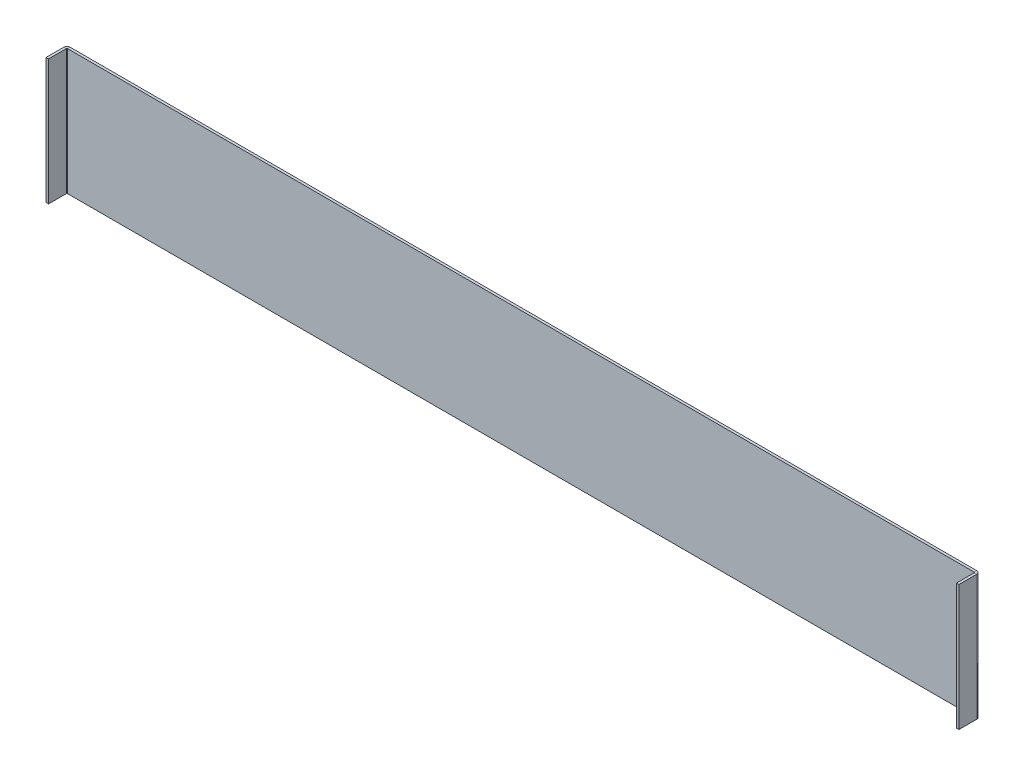
ISO-10303-21;
HEADER;
FILE_DESCRIPTION(('STEP AP214'),'2;1');
FILE_NAME('part.step','',(''),(''),'','','');
FILE_SCHEMA(('AUTOMOTIVE_DESIGN { 1 0 10303 214 1 1 1 1 }'));
ENDSEC;
DATA;
#1=APPLICATION_CONTEXT('core data for automotive mechanical design processes');
#2=APPLICATION_PROTOCOL_DEFINITION('international standard','automotive_design',2000,#1);
#3=PRODUCT_CONTEXT('',#1,'mechanical');
#4=PRODUCT('Part','Part','',(#3));
#5=PRODUCT_RELATED_PRODUCT_CATEGORY('part','',(#4));
#6=PRODUCT_DEFINITION_FORMATION('','',#4);
#7=PRODUCT_DEFINITION_CONTEXT('part definition',#1,'design');
#8=PRODUCT_DEFINITION('design','',#6,#7);
#9=PRODUCT_DEFINITION_SHAPE('','',#8);
#10=(LENGTH_UNIT() NAMED_UNIT(*) SI_UNIT(.MILLI.,.METRE.));
#11=(NAMED_UNIT(*) PLANE_ANGLE_UNIT() SI_UNIT($,.RADIAN.));
#12=(NAMED_UNIT(*) SI_UNIT($,.STERADIAN.) SOLID_ANGLE_UNIT());
#13=UNCERTAINTY_MEASURE_WITH_UNIT(LENGTH_MEASURE(1.E-05),#10,'distance_accuracy_value','');
#14=(GEOMETRIC_REPRESENTATION_CONTEXT(3) GLOBAL_UNCERTAINTY_ASSIGNED_CONTEXT((#13)) GLOBAL_UNIT_ASSIGNED_CONTEXT((#10,
#11,#12)) REPRESENTATION_CONTEXT('',''));
#15=CARTESIAN_POINT('',(0.,0.,0.));
#16=DIRECTION('',(0.,0.,1.));
#17=DIRECTION('',(1.,0.,0.));
#18=AXIS2_PLACEMENT_3D('',#15,#16,#17);
#19=CARTESIAN_POINT('',(-541.250000000007,75.,-24.9999999999999));
#20=DIRECTION('',(0.,1.,0.));
#21=DIRECTION('',(0.,0.,1.));
#22=AXIS2_PLACEMENT_3D('',#19,#20,#21);
#23=PLANE('',#22);
#24=DIRECTION('',(0.,0.,1.));
#25=VECTOR('',#24,1.);
#26=CARTESIAN_POINT('',(-541.250000000007,75.,-24.9999999999999));
#27=LINE('',#26,#25);
#28=CARTESIAN_POINT('',(-541.250000000007,75.,-24.9999999999999));
#29=VERTEX_POINT('',#28);
#30=CARTESIAN_POINT('',(-541.250000000007,75.,-21.9999999999999));
#31=VERTEX_POINT('',#30);
#32=EDGE_CURVE('E11',#29,#31,#27,.T.);
#33=ORIENTED_EDGE('',*,*,#32,.F.);
#34=CARTESIAN_POINT('',(-541.250000000007,75.,-21.2499999999999));
#35=DIRECTION('',(0.,1.,0.));
#36=DIRECTION('',(0.,0.,1.));
#37=AXIS2_PLACEMENT_3D('',#34,#35,#36);
#38=CIRCLE('',#37,3.75);
#39=CARTESIAN_POINT('',(-545.000000000007,75.,-21.2499999999999));
#40=VERTEX_POINT('',#39);
#41=EDGE_CURVE('E290',#40,#29,#38,.F.);
#42=ORIENTED_EDGE('',*,*,#41,.F.);
#43=DIRECTION('',(-1.,0.,0.));
#44=VECTOR('',#43,1.);
#45=CARTESIAN_POINT('',(-542.000000000007,75.,-21.2499999999999));
#46=LINE('',#45,#44);
#47=CARTESIAN_POINT('',(-542.000000000007,75.,-21.2499999999999));
#48=VERTEX_POINT('',#47);
#49=EDGE_CURVE('E52',#48,#40,#46,.T.);
#50=ORIENTED_EDGE('',*,*,#49,.F.);
#51=CARTESIAN_POINT('',(-541.250000000007,75.,-21.2499999999999));
#52=DIRECTION('',(0.,1.,0.));
#53=DIRECTION('',(1.,0.,0.));
#54=AXIS2_PLACEMENT_3D('',#51,#52,#53);
#55=CIRCLE('',#54,0.75);
#56=EDGE_CURVE('E153',#48,#31,#55,.F.);
#57=ORIENTED_EDGE('',*,*,#56,.T.);
#58=EDGE_LOOP('',(#33,#42,#50,#57));
#59=FACE_BOUND('',#58,.T.);
#60=ADVANCED_FACE('F43',(#59),#23,.T.);
#61=CARTESIAN_POINT('',(-542.000000000007,75.,-21.2499999999999));
#62=DIRECTION('',(0.,1.,0.));
#63=DIRECTION('',(0.,0.,1.));
#64=AXIS2_PLACEMENT_3D('',#61,#62,#63);
#65=PLANE('',#64);
#66=DIRECTION('',(1.,0.,0.));
#67=VECTOR('',#66,1.);
#68=CARTESIAN_POINT('',(-545.000000000007,75.,-24.9999999999999));
#69=LINE('',#68,#67);
#70=CARTESIAN_POINT('',(541.250000000006,75.,-24.9999999999999));
#71=VERTEX_POINT('',#70);
#72=EDGE_CURVE('E147',#29,#71,#69,.T.);
#73=ORIENTED_EDGE('',*,*,#72,.F.);
#74=ORIENTED_EDGE('',*,*,#32,.T.);
#75=DIRECTION('',(1.,0.,0.));
#76=VECTOR('',#75,1.);
#77=CARTESIAN_POINT('',(-545.000000000007,75.,-21.9999999999999));
#78=LINE('',#77,#76);
#79=CARTESIAN_POINT('',(541.250000000006,75.,-21.9999999999999));
#80=VERTEX_POINT('',#79);
#81=EDGE_CURVE('E144',#31,#80,#78,.T.);
#82=ORIENTED_EDGE('',*,*,#81,.T.);
#83=DIRECTION('',(0.,0.,-1.));
#84=VECTOR('',#83,1.);
#85=CARTESIAN_POINT('',(541.250000000006,75.,-21.9999999999999));
#86=LINE('',#85,#84);
#87=EDGE_CURVE('E265',#80,#71,#86,.T.);
#88=ORIENTED_EDGE('',*,*,#87,.T.);
#89=EDGE_LOOP('',(#73,#74,#82,#88));
#90=FACE_BOUND('',#89,.T.);
#91=ADVANCED_FACE('F142',(#90),#65,.T.);
#92=CARTESIAN_POINT('',(-545.000000000007,-75.,-21.2499999999999));
#93=DIRECTION('',(0.,-1.,0.));
#94=DIRECTION('',(0.,0.,-1.));
#95=AXIS2_PLACEMENT_3D('',#92,#93,#94);
#96=PLANE('',#95);
#97=DIRECTION('',(1.,0.,0.));
#98=VECTOR('',#97,1.);
#99=CARTESIAN_POINT('',(-545.000000000007,-75.,-21.2499999999999));
#100=LINE('',#99,#98);
#101=CARTESIAN_POINT('',(-545.000000000007,-75.,-21.2499999999999));
#102=VERTEX_POINT('',#101);
#103=CARTESIAN_POINT('',(-542.000000000007,-75.,-21.2499999999999));
#104=VERTEX_POINT('',#103);
#105=EDGE_CURVE('E273',#102,#104,#100,.T.);
#106=ORIENTED_EDGE('',*,*,#105,.F.);
#107=CARTESIAN_POINT('',(-541.250000000007,-75.,-21.2499999999999));
#108=DIRECTION('',(0.,1.,0.));
#109=DIRECTION('',(0.,0.,1.));
#110=AXIS2_PLACEMENT_3D('',#107,#108,#109);
#111=CIRCLE('',#110,3.75);
#112=CARTESIAN_POINT('',(-541.250000000007,-75.,-24.9999999999999));
#113=VERTEX_POINT('',#112);
#114=EDGE_CURVE('E202',#102,#113,#111,.F.);
#115=ORIENTED_EDGE('',*,*,#114,.T.);
#116=DIRECTION('',(0.,0.,-1.));
#117=VECTOR('',#116,1.);
#118=CARTESIAN_POINT('',(-541.250000000007,-75.,-21.9999999999999));
#119=LINE('',#118,#117);
#120=CARTESIAN_POINT('',(-541.250000000007,-75.,-21.9999999999999));
#121=VERTEX_POINT('',#120);
#122=EDGE_CURVE('E270',#121,#113,#119,.T.);
#123=ORIENTED_EDGE('',*,*,#122,.F.);
#124=CARTESIAN_POINT('',(-541.250000000007,-75.,-21.2499999999999));
#125=DIRECTION('',(0.,1.,0.));
#126=DIRECTION('',(1.,0.,0.));
#127=AXIS2_PLACEMENT_3D('',#124,#125,#126);
#128=CIRCLE('',#127,0.75);
#129=EDGE_CURVE('E166',#104,#121,#128,.F.);
#130=ORIENTED_EDGE('',*,*,#129,.F.);
#131=EDGE_LOOP('',(#106,#115,#123,#130));
#132=FACE_BOUND('',#131,.T.);
#133=ADVANCED_FACE('F359',(#132),#96,.T.);
#134=CARTESIAN_POINT('',(-541.250000000007,-75.,-21.9999999999999));
#135=DIRECTION('',(0.,-1.,0.));
#136=DIRECTION('',(0.,0.,-1.));
#137=AXIS2_PLACEMENT_3D('',#134,#135,#136);
#138=PLANE('',#137);
#139=DIRECTION('',(0.,0.,-1.));
#140=VECTOR('',#139,1.);
#141=CARTESIAN_POINT('',(-545.000000000007,-75.,0.));
#142=LINE('',#141,#140);
#143=CARTESIAN_POINT('',(-545.000000000007,-75.,0.));
#144=VERTEX_POINT('',#143);
#145=EDGE_CURVE('E206',#144,#102,#142,.T.);
#146=ORIENTED_EDGE('',*,*,#145,.T.);
#147=ORIENTED_EDGE('',*,*,#105,.T.);
#148=DIRECTION('',(0.,0.,-1.));
#149=VECTOR('',#148,1.);
#150=CARTESIAN_POINT('',(-542.000000000007,-75.,0.));
#151=LINE('',#150,#149);
#152=CARTESIAN_POINT('',(-542.000000000007,-75.,0.));
#153=VERTEX_POINT('',#152);
#154=EDGE_CURVE('E214',#153,#104,#151,.T.);
#155=ORIENTED_EDGE('',*,*,#154,.F.);
#156=DIRECTION('',(-1.,0.,0.));
#157=VECTOR('',#156,1.);
#158=CARTESIAN_POINT('',(-542.000000000007,-75.,0.));
#159=LINE('',#158,#157);
#160=EDGE_CURVE('E210',#153,#144,#159,.T.);
#161=ORIENTED_EDGE('',*,*,#160,.T.);
#162=EDGE_LOOP('',(#146,#147,#155,#161));
#163=FACE_BOUND('',#162,.T.);
#164=ADVANCED_FACE('F362',(#163),#138,.T.);
#165=CARTESIAN_POINT('',(545.000000000006,75.,-21.2499999999999));
#166=DIRECTION('',(0.,1.,0.));
#167=DIRECTION('',(0.,0.,1.));
#168=AXIS2_PLACEMENT_3D('',#165,#166,#167);
#169=PLANE('',#168);
#170=DIRECTION('',(-1.,0.,0.));
#171=VECTOR('',#170,1.);
#172=CARTESIAN_POINT('',(545.000000000006,75.,-21.2499999999999));
#173=LINE('',#172,#171);
#174=CARTESIAN_POINT('',(545.000000000006,75.,-21.2499999999999));
#175=VERTEX_POINT('',#174);
#176=CARTESIAN_POINT('',(542.000000000006,75.,-21.2499999999999));
#177=VERTEX_POINT('',#176);
#178=EDGE_CURVE('E60',#175,#177,#173,.T.);
#179=ORIENTED_EDGE('',*,*,#178,.F.);
#180=CARTESIAN_POINT('',(541.250000000006,75.,-21.2499999999999));
#181=DIRECTION('',(0.,1.,0.));
#182=DIRECTION('',(0.,0.,1.));
#183=AXIS2_PLACEMENT_3D('',#180,#181,#182);
#184=CIRCLE('',#183,3.75);
#185=EDGE_CURVE('E309',#71,#175,#184,.F.);
#186=ORIENTED_EDGE('',*,*,#185,.F.);
#187=ORIENTED_EDGE('',*,*,#87,.F.);
#188=CARTESIAN_POINT('',(541.250000000006,75.,-21.2499999999999));
#189=DIRECTION('',(0.,1.,0.));
#190=DIRECTION('',(1.,0.,0.));
#191=AXIS2_PLACEMENT_3D('',#188,#189,#190);
#192=CIRCLE('',#191,0.75);
#193=EDGE_CURVE('E176',#80,#177,#192,.F.);
#194=ORIENTED_EDGE('',*,*,#193,.T.);
#195=EDGE_LOOP('',(#179,#186,#187,#194));
#196=FACE_BOUND('',#195,.T.);
#197=ADVANCED_FACE('F354',(#196),#169,.T.);
#198=CARTESIAN_POINT('',(541.250000000006,75.,-21.9999999999999));
#199=DIRECTION('',(0.,1.,0.));
#200=DIRECTION('',(0.,0.,1.));
#201=AXIS2_PLACEMENT_3D('',#198,#199,#200);
#202=PLANE('',#201);
#203=DIRECTION('',(0.,0.,1.));
#204=VECTOR('',#203,1.);
#205=CARTESIAN_POINT('',(545.000000000006,75.,-24.9999999999999));
#206=LINE('',#205,#204);
#207=CARTESIAN_POINT('',(545.000000000006,75.,0.));
#208=VERTEX_POINT('',#207);
#209=EDGE_CURVE('E313',#175,#208,#206,.T.);
#210=ORIENTED_EDGE('',*,*,#209,.F.);
#211=ORIENTED_EDGE('',*,*,#178,.T.);
#212=DIRECTION('',(0.,0.,1.));
#213=VECTOR('',#212,1.);
#214=CARTESIAN_POINT('',(542.000000000006,75.,-25.));
#215=LINE('',#214,#213);
#216=CARTESIAN_POINT('',(542.000000000006,75.,0.));
#217=VERTEX_POINT('',#216);
#218=EDGE_CURVE('E114',#177,#217,#215,.T.);
#219=ORIENTED_EDGE('',*,*,#218,.T.);
#220=DIRECTION('',(-1.,0.,0.));
#221=VECTOR('',#220,1.);
#222=CARTESIAN_POINT('',(545.000000000006,75.,0.));
#223=LINE('',#222,#221);
#224=EDGE_CURVE('E317',#208,#217,#223,.T.);
#225=ORIENTED_EDGE('',*,*,#224,.F.);
#226=EDGE_LOOP('',(#210,#211,#219,#225));
#227=FACE_BOUND('',#226,.T.);
#228=ADVANCED_FACE('F343',(#227),#202,.T.);
#229=CARTESIAN_POINT('',(541.250000000006,-75.,-24.9999999999999));
#230=DIRECTION('',(0.,-1.,0.));
#231=DIRECTION('',(0.,0.,-1.));
#232=AXIS2_PLACEMENT_3D('',#229,#230,#231);
#233=PLANE('',#232);
#234=DIRECTION('',(0.,0.,1.));
#235=VECTOR('',#234,1.);
#236=CARTESIAN_POINT('',(541.250000000006,-75.,-24.9999999999999));
#237=LINE('',#236,#235);
#238=CARTESIAN_POINT('',(541.250000000006,-75.,-24.9999999999999));
#239=VERTEX_POINT('',#238);
#240=CARTESIAN_POINT('',(541.250000000006,-75.,-21.9999999999999));
#241=VERTEX_POINT('',#240);
#242=EDGE_CURVE('E101',#239,#241,#237,.T.);
#243=ORIENTED_EDGE('',*,*,#242,.F.);
#244=CARTESIAN_POINT('',(541.250000000006,-75.,-21.2499999999999));
#245=DIRECTION('',(0.,1.,0.));
#246=DIRECTION('',(0.,0.,1.));
#247=AXIS2_PLACEMENT_3D('',#244,#245,#246);
#248=CIRCLE('',#247,3.75);
#249=CARTESIAN_POINT('',(545.000000000006,-75.,-21.2499999999999));
#250=VERTEX_POINT('',#249);
#251=EDGE_CURVE('E196',#239,#250,#248,.F.);
#252=ORIENTED_EDGE('',*,*,#251,.T.);
#253=DIRECTION('',(1.,0.,0.));
#254=VECTOR('',#253,1.);
#255=CARTESIAN_POINT('',(542.000000000006,-75.,-21.2499999999999));
#256=LINE('',#255,#254);
#257=CARTESIAN_POINT('',(542.000000000006,-75.,-21.2499999999999));
#258=VERTEX_POINT('',#257);
#259=EDGE_CURVE('E108',#258,#250,#256,.T.);
#260=ORIENTED_EDGE('',*,*,#259,.F.);
#261=CARTESIAN_POINT('',(541.250000000006,-75.,-21.2499999999999));
#262=DIRECTION('',(0.,1.,0.));
#263=DIRECTION('',(1.,0.,0.));
#264=AXIS2_PLACEMENT_3D('',#261,#262,#263);
#265=CIRCLE('',#264,0.75);
#266=EDGE_CURVE('E223',#241,#258,#265,.F.);
#267=ORIENTED_EDGE('',*,*,#266,.F.);
#268=EDGE_LOOP('',(#243,#252,#260,#267));
#269=FACE_BOUND('',#268,.T.);
#270=ADVANCED_FACE('F391',(#269),#233,.T.);
#271=CARTESIAN_POINT('',(542.000000000006,-75.,-21.2499999999999));
#272=DIRECTION('',(0.,-1.,0.));
#273=DIRECTION('',(0.,0.,-1.));
#274=AXIS2_PLACEMENT_3D('',#271,#272,#273);
#275=PLANE('',#274);
#276=DIRECTION('',(1.,0.,0.));
#277=VECTOR('',#276,1.);
#278=CARTESIAN_POINT('',(-545.000000000007,-75.,-24.9999999999999));
#279=LINE('',#278,#277);
#280=EDGE_CURVE('E199',#113,#239,#279,.T.);
#281=ORIENTED_EDGE('',*,*,#280,.T.);
#282=ORIENTED_EDGE('',*,*,#242,.T.);
#283=DIRECTION('',(1.,0.,0.));
#284=VECTOR('',#283,1.);
#285=CARTESIAN_POINT('',(-545.000000000007,-75.,-21.9999999999999));
#286=LINE('',#285,#284);
#287=EDGE_CURVE('E220',#121,#241,#286,.T.);
#288=ORIENTED_EDGE('',*,*,#287,.F.);
#289=ORIENTED_EDGE('',*,*,#122,.T.);
#290=EDGE_LOOP('',(#281,#282,#288,#289));
#291=FACE_BOUND('',#290,.T.);
#292=ADVANCED_FACE('F394',(#291),#275,.T.);
#293=CARTESIAN_POINT('',(542.000000000006,75.,-25.));
#294=DIRECTION('',(1.,0.,0.));
#295=DIRECTION('',(0.,0.,-1.));
#296=AXIS2_PLACEMENT_3D('',#293,#294,#295);
#297=PLANE('',#296);
#298=DIRECTION('',(0.,0.,1.));
#299=VECTOR('',#298,1.);
#300=CARTESIAN_POINT('',(542.000000000006,-75.,-25.));
#301=LINE('',#300,#299);
#302=CARTESIAN_POINT('',(542.000000000006,-75.,0.));
#303=VERTEX_POINT('',#302);
#304=EDGE_CURVE('E184',#258,#303,#301,.T.);
#305=ORIENTED_EDGE('',*,*,#304,.T.);
#306=DIRECTION('',(0.,-1.,0.));
#307=VECTOR('',#306,1.);
#308=CARTESIAN_POINT('',(542.000000000006,75.,0.));
#309=LINE('',#308,#307);
#310=EDGE_CURVE('E258',#217,#303,#309,.T.);
#311=ORIENTED_EDGE('',*,*,#310,.F.);
#312=ORIENTED_EDGE('',*,*,#218,.F.);
#313=DIRECTION('',(0.,-1.,0.));
#314=VECTOR('',#313,1.);
#315=CARTESIAN_POINT('',(542.000000000006,75.,-21.2499999999999));
#316=LINE('',#315,#314);
#317=EDGE_CURVE('E180',#177,#258,#316,.T.);
#318=ORIENTED_EDGE('',*,*,#317,.T.);
#319=EDGE_LOOP('',(#305,#311,#312,#318));
#320=FACE_BOUND('',#319,.T.);
#321=ADVANCED_FACE('F397',(#320),#297,.F.);
#322=CARTESIAN_POINT('',(545.000000000006,75.,0.));
#323=DIRECTION('',(0.,0.,1.));
#324=DIRECTION('',(1.,0.,0.));
#325=AXIS2_PLACEMENT_3D('',#322,#323,#324);
#326=PLANE('',#325);
#327=DIRECTION('',(-1.,0.,0.));
#328=VECTOR('',#327,1.);
#329=CARTESIAN_POINT('',(545.000000000006,-75.,0.));
#330=LINE('',#329,#328);
#331=CARTESIAN_POINT('',(545.000000000006,-75.,0.));
#332=VERTEX_POINT('',#331);
#333=EDGE_CURVE('E188',#332,#303,#330,.T.);
#334=ORIENTED_EDGE('',*,*,#333,.F.);
#335=DIRECTION('',(0.,-1.,0.));
#336=VECTOR('',#335,1.);
#337=CARTESIAN_POINT('',(545.000000000006,75.,0.));
#338=LINE('',#337,#336);
#339=EDGE_CURVE('E255',#208,#332,#338,.T.);
#340=ORIENTED_EDGE('',*,*,#339,.F.);
#341=ORIENTED_EDGE('',*,*,#224,.T.);
#342=ORIENTED_EDGE('',*,*,#310,.T.);
#343=EDGE_LOOP('',(#334,#340,#341,#342));
#344=FACE_BOUND('',#343,.T.);
#345=ADVANCED_FACE('F342',(#344),#326,.T.);
#346=CARTESIAN_POINT('',(545.000000000006,75.,-24.9999999999999));
#347=DIRECTION('',(1.,0.,0.));
#348=DIRECTION('',(0.,0.,-1.));
#349=AXIS2_PLACEMENT_3D('',#346,#347,#348);
#350=PLANE('',#349);
#351=DIRECTION('',(0.,0.,1.));
#352=VECTOR('',#351,1.);
#353=CARTESIAN_POINT('',(545.000000000006,-75.,-24.9999999999999));
#354=LINE('',#353,#352);
#355=EDGE_CURVE('E192',#250,#332,#354,.T.);
#356=ORIENTED_EDGE('',*,*,#355,.F.);
#357=DIRECTION('',(0.,-1.,0.));
#358=VECTOR('',#357,1.);
#359=CARTESIAN_POINT('',(545.000000000006,75.,-21.2499999999999));
#360=LINE('',#359,#358);
#361=EDGE_CURVE('E251',#175,#250,#360,.T.);
#362=ORIENTED_EDGE('',*,*,#361,.F.);
#363=ORIENTED_EDGE('',*,*,#209,.T.);
#364=ORIENTED_EDGE('',*,*,#339,.T.);
#365=EDGE_LOOP('',(#356,#362,#363,#364));
#366=FACE_BOUND('',#365,.T.);
#367=ADVANCED_FACE('F347',(#366),#350,.T.);
#368=CARTESIAN_POINT('',(541.250000000006,75.,-21.2499999999999));
#369=DIRECTION('',(0.,-1.,0.));
#370=DIRECTION('',(0.,0.,-1.));
#371=AXIS2_PLACEMENT_3D('',#368,#369,#370);
#372=CYLINDRICAL_SURFACE('',#371,3.75);
#373=ORIENTED_EDGE('',*,*,#251,.F.);
#374=DIRECTION('',(0.,-1.,0.));
#375=VECTOR('',#374,1.);
#376=CARTESIAN_POINT('',(541.250000000006,75.,-24.9999999999999));
#377=LINE('',#376,#375);
#378=EDGE_CURVE('E247',#71,#239,#377,.T.);
#379=ORIENTED_EDGE('',*,*,#378,.F.);
#380=ORIENTED_EDGE('',*,*,#185,.T.);
#381=ORIENTED_EDGE('',*,*,#361,.T.);
#382=EDGE_LOOP('',(#373,#379,#380,#381));
#383=FACE_BOUND('',#382,.T.);
#384=ADVANCED_FACE('F350',(#383),#372,.T.);
#385=CARTESIAN_POINT('',(-545.000000000007,75.,-24.9999999999999));
#386=DIRECTION('',(0.,0.,-1.));
#387=DIRECTION('',(-1.,0.,0.));
#388=AXIS2_PLACEMENT_3D('',#385,#386,#387);
#389=PLANE('',#388);
#390=ORIENTED_EDGE('',*,*,#280,.F.);
#391=DIRECTION('',(0.,-1.,0.));
#392=VECTOR('',#391,1.);
#393=CARTESIAN_POINT('',(-541.250000000007,75.,-24.9999999999999));
#394=LINE('',#393,#392);
#395=EDGE_CURVE('E243',#29,#113,#394,.T.);
#396=ORIENTED_EDGE('',*,*,#395,.F.);
#397=ORIENTED_EDGE('',*,*,#72,.T.);
#398=ORIENTED_EDGE('',*,*,#378,.T.);
#399=EDGE_LOOP('',(#390,#396,#397,#398));
#400=FACE_BOUND('',#399,.T.);
#401=ADVANCED_FACE('F357',(#400),#389,.T.);
#402=CARTESIAN_POINT('',(-541.250000000007,75.,-21.2499999999999));
#403=DIRECTION('',(0.,-1.,0.));
#404=DIRECTION('',(0.,0.,-1.));
#405=AXIS2_PLACEMENT_3D('',#402,#403,#404);
#406=CYLINDRICAL_SURFACE('',#405,3.75);
#407=ORIENTED_EDGE('',*,*,#114,.F.);
#408=DIRECTION('',(0.,-1.,0.));
#409=VECTOR('',#408,1.);
#410=CARTESIAN_POINT('',(-545.000000000007,75.,-21.2499999999999));
#411=LINE('',#410,#409);
#412=EDGE_CURVE('E239',#40,#102,#411,.T.);
#413=ORIENTED_EDGE('',*,*,#412,.F.);
#414=ORIENTED_EDGE('',*,*,#41,.T.);
#415=ORIENTED_EDGE('',*,*,#395,.T.);
#416=EDGE_LOOP('',(#407,#413,#414,#415));
#417=FACE_BOUND('',#416,.T.);
#418=ADVANCED_FACE('F289',(#417),#406,.T.);
#419=CARTESIAN_POINT('',(-545.000000000007,75.,0.));
#420=DIRECTION('',(-1.,0.,0.));
#421=DIRECTION('',(0.,0.,1.));
#422=AXIS2_PLACEMENT_3D('',#419,#420,#421);
#423=PLANE('',#422);
#424=ORIENTED_EDGE('',*,*,#145,.F.);
#425=DIRECTION('',(0.,-1.,0.));
#426=VECTOR('',#425,1.);
#427=CARTESIAN_POINT('',(-545.000000000007,75.,0.));
#428=LINE('',#427,#426);
#429=CARTESIAN_POINT('',(-545.000000000007,75.,0.));
#430=VERTEX_POINT('',#429);
#431=EDGE_CURVE('E236',#430,#144,#428,.T.);
#432=ORIENTED_EDGE('',*,*,#431,.F.);
#433=DIRECTION('',(0.,0.,-1.));
#434=VECTOR('',#433,1.);
#435=CARTESIAN_POINT('',(-545.000000000007,75.,0.));
#436=LINE('',#435,#434);
#437=EDGE_CURVE('E283',#430,#40,#436,.T.);
#438=ORIENTED_EDGE('',*,*,#437,.T.);
#439=ORIENTED_EDGE('',*,*,#412,.T.);
#440=EDGE_LOOP('',(#424,#432,#438,#439));
#441=FACE_BOUND('',#440,.T.);
#442=ADVANCED_FACE('F295',(#441),#423,.T.);
#443=CARTESIAN_POINT('',(-542.000000000007,75.,0.));
#444=DIRECTION('',(0.,0.,1.));
#445=DIRECTION('',(1.,0.,0.));
#446=AXIS2_PLACEMENT_3D('',#443,#444,#445);
#447=PLANE('',#446);
#448=ORIENTED_EDGE('',*,*,#160,.F.);
#449=DIRECTION('',(0.,-1.,0.));
#450=VECTOR('',#449,1.);
#451=CARTESIAN_POINT('',(-542.000000000007,75.,0.));
#452=LINE('',#451,#450);
#453=CARTESIAN_POINT('',(-542.000000000007,75.,0.));
#454=VERTEX_POINT('',#453);
#455=EDGE_CURVE('E233',#454,#153,#452,.T.);
#456=ORIENTED_EDGE('',*,*,#455,.F.);
#457=DIRECTION('',(-1.,0.,0.));
#458=VECTOR('',#457,1.);
#459=CARTESIAN_POINT('',(-542.000000000007,75.,0.));
#460=LINE('',#459,#458);
#461=EDGE_CURVE('E297',#454,#430,#460,.T.);
#462=ORIENTED_EDGE('',*,*,#461,.T.);
#463=ORIENTED_EDGE('',*,*,#431,.T.);
#464=EDGE_LOOP('',(#448,#456,#462,#463));
#465=FACE_BOUND('',#464,.T.);
#466=ADVANCED_FACE('F367',(#465),#447,.T.);
#467=CARTESIAN_POINT('',(-542.000000000007,75.,0.));
#468=DIRECTION('',(-1.,0.,0.));
#469=DIRECTION('',(0.,0.,1.));
#470=AXIS2_PLACEMENT_3D('',#467,#468,#469);
#471=PLANE('',#470);
#472=ORIENTED_EDGE('',*,*,#154,.T.);
#473=DIRECTION('',(0.,-1.,0.));
#474=VECTOR('',#473,1.);
#475=CARTESIAN_POINT('',(-542.000000000007,75.,-21.2499999999999));
#476=LINE('',#475,#474);
#477=EDGE_CURVE('E169',#48,#104,#476,.T.);
#478=ORIENTED_EDGE('',*,*,#477,.F.);
#479=DIRECTION('',(0.,0.,-1.));
#480=VECTOR('',#479,1.);
#481=CARTESIAN_POINT('',(-542.000000000007,75.,0.));
#482=LINE('',#481,#480);
#483=EDGE_CURVE('E159',#454,#48,#482,.T.);
#484=ORIENTED_EDGE('',*,*,#483,.F.);
#485=ORIENTED_EDGE('',*,*,#455,.T.);
#486=EDGE_LOOP('',(#472,#478,#484,#485));
#487=FACE_BOUND('',#486,.T.);
#488=ADVANCED_FACE('F365',(#487),#471,.F.);
#489=CARTESIAN_POINT('',(-541.250000000007,75.,-21.2499999999999));
#490=DIRECTION('',(0.,-1.,0.));
#491=DIRECTION('',(0.,0.,-1.));
#492=AXIS2_PLACEMENT_3D('',#489,#490,#491);
#493=CYLINDRICAL_SURFACE('',#492,0.75);
#494=ORIENTED_EDGE('',*,*,#129,.T.);
#495=DIRECTION('',(0.,-1.,0.));
#496=VECTOR('',#495,1.);
#497=CARTESIAN_POINT('',(-541.250000000007,75.,-21.9999999999999));
#498=LINE('',#497,#496);
#499=EDGE_CURVE('E163',#31,#121,#498,.T.);
#500=ORIENTED_EDGE('',*,*,#499,.F.);
#501=ORIENTED_EDGE('',*,*,#56,.F.);
#502=ORIENTED_EDGE('',*,*,#477,.T.);
#503=EDGE_LOOP('',(#494,#500,#501,#502));
#504=FACE_BOUND('',#503,.T.);
#505=ADVANCED_FACE('F164',(#504),#493,.F.);
#506=CARTESIAN_POINT('',(-545.000000000007,75.,-21.9999999999999));
#507=DIRECTION('',(0.,0.,-1.));
#508=DIRECTION('',(-1.,0.,0.));
#509=AXIS2_PLACEMENT_3D('',#506,#507,#508);
#510=PLANE('',#509);
#511=ORIENTED_EDGE('',*,*,#287,.T.);
#512=DIRECTION('',(0.,-1.,0.));
#513=VECTOR('',#512,1.);
#514=CARTESIAN_POINT('',(541.250000000006,75.,-21.9999999999999));
#515=LINE('',#514,#513);
#516=EDGE_CURVE('E170',#80,#241,#515,.T.);
#517=ORIENTED_EDGE('',*,*,#516,.F.);
#518=ORIENTED_EDGE('',*,*,#81,.F.);
#519=ORIENTED_EDGE('',*,*,#499,.T.);
#520=EDGE_LOOP('',(#511,#517,#518,#519));
#521=FACE_BOUND('',#520,.T.);
#522=ADVANCED_FACE('F172',(#521),#510,.F.);
#523=CARTESIAN_POINT('',(541.250000000006,75.,-21.2499999999999));
#524=DIRECTION('',(0.,-1.,0.));
#525=DIRECTION('',(0.,0.,-1.));
#526=AXIS2_PLACEMENT_3D('',#523,#524,#525);
#527=CYLINDRICAL_SURFACE('',#526,0.75);
#528=ORIENTED_EDGE('',*,*,#266,.T.);
#529=ORIENTED_EDGE('',*,*,#317,.F.);
#530=ORIENTED_EDGE('',*,*,#193,.F.);
#531=ORIENTED_EDGE('',*,*,#516,.T.);
#532=EDGE_LOOP('',(#528,#529,#530,#531));
#533=FACE_BOUND('',#532,.T.);
#534=ADVANCED_FACE('F445',(#533),#527,.F.);
#535=CARTESIAN_POINT('',(541.250000000006,75.,-21.2499999999999));
#536=DIRECTION('',(0.,1.,0.));
#537=DIRECTION('',(1.,0.,0.));
#538=AXIS2_PLACEMENT_3D('',#535,#536,#537);
#539=PLANE('',#538);
#540=ORIENTED_EDGE('',*,*,#483,.T.);
#541=ORIENTED_EDGE('',*,*,#49,.T.);
#542=ORIENTED_EDGE('',*,*,#437,.F.);
#543=ORIENTED_EDGE('',*,*,#461,.F.);
#544=EDGE_LOOP('',(#540,#541,#542,#543));
#545=FACE_BOUND('',#544,.T.);
#546=ADVANCED_FACE('F280',(#545),#539,.T.);
#547=CARTESIAN_POINT('',(541.250000000006,-75.,-21.2499999999999));
#548=DIRECTION('',(0.,1.,0.));
#549=DIRECTION('',(1.,0.,0.));
#550=AXIS2_PLACEMENT_3D('',#547,#548,#549);
#551=PLANE('',#550);
#552=ORIENTED_EDGE('',*,*,#304,.F.);
#553=ORIENTED_EDGE('',*,*,#259,.T.);
#554=ORIENTED_EDGE('',*,*,#355,.T.);
#555=ORIENTED_EDGE('',*,*,#333,.T.);
#556=EDGE_LOOP('',(#552,#553,#554,#555));
#557=FACE_BOUND('',#556,.T.);
#558=ADVANCED_FACE('F490',(#557),#551,.F.);
#559=CLOSED_SHELL('',(#60,#91,#133,#164,#197,#228,#270,#292,#321,#345,#367,#384,#401,#418,#442,
#466,#488,#505,#522,#534,#546,#558));
#560=MANIFOLD_SOLID_BREP('B2',#559);
#561=ADVANCED_BREP_SHAPE_REPRESENTATION('',(#18,#560),#14);
#562=SHAPE_DEFINITION_REPRESENTATION(#9,#561);
ENDSEC;
END-ISO-10303-21;
